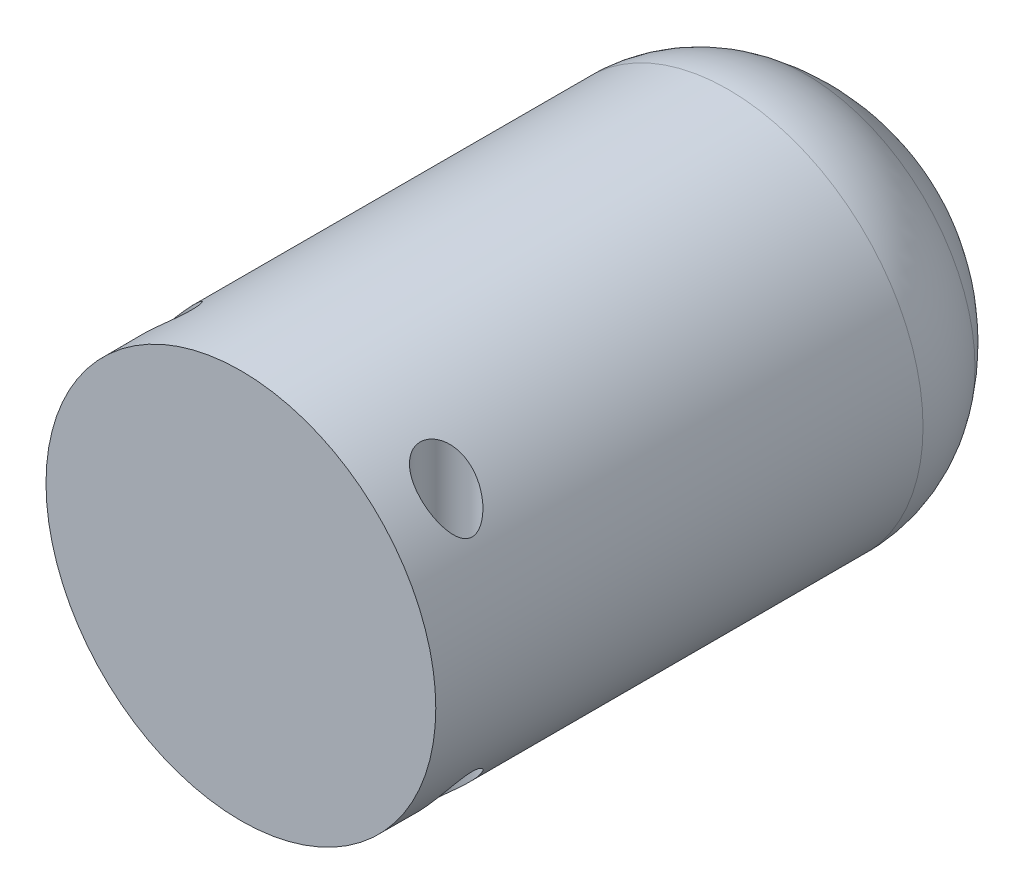
ISO-10303-21;
HEADER;
FILE_DESCRIPTION(('STEP AP214'),'2;1');
FILE_NAME('part.step','',(''),(''),'','','');
FILE_SCHEMA(('AUTOMOTIVE_DESIGN { 1 0 10303 214 1 1 1 1 }'));
ENDSEC;
DATA;
#1=APPLICATION_CONTEXT('core data for automotive mechanical design processes');
#2=APPLICATION_PROTOCOL_DEFINITION('international standard','automotive_design',2000,#1);
#3=PRODUCT_CONTEXT('',#1,'mechanical');
#4=PRODUCT('Part','Part','',(#3));
#5=PRODUCT_RELATED_PRODUCT_CATEGORY('part','',(#4));
#6=PRODUCT_DEFINITION_FORMATION('','',#4);
#7=PRODUCT_DEFINITION_CONTEXT('part definition',#1,'design');
#8=PRODUCT_DEFINITION('design','',#6,#7);
#9=PRODUCT_DEFINITION_SHAPE('','',#8);
#10=(LENGTH_UNIT() NAMED_UNIT(*) SI_UNIT(.MILLI.,.METRE.));
#11=(NAMED_UNIT(*) PLANE_ANGLE_UNIT() SI_UNIT($,.RADIAN.));
#12=(NAMED_UNIT(*) SI_UNIT($,.STERADIAN.) SOLID_ANGLE_UNIT());
#13=UNCERTAINTY_MEASURE_WITH_UNIT(LENGTH_MEASURE(1.E-05),#10,'distance_accuracy_value','');
#14=(GEOMETRIC_REPRESENTATION_CONTEXT(3) GLOBAL_UNCERTAINTY_ASSIGNED_CONTEXT((#13)) GLOBAL_UNIT_ASSIGNED_CONTEXT((#10,
#11,#12)) REPRESENTATION_CONTEXT('',''));
#15=CARTESIAN_POINT('',(0.,0.,0.));
#16=DIRECTION('',(0.,0.,1.));
#17=DIRECTION('',(1.,0.,0.));
#18=AXIS2_PLACEMENT_3D('',#15,#16,#17);
#19=CARTESIAN_POINT('',(0.,0.,4.));
#20=DIRECTION('',(0.,0.,-1.));
#21=DIRECTION('',(-1.,0.,0.));
#22=AXIS2_PLACEMENT_3D('',#19,#20,#21);
#23=CYLINDRICAL_SURFACE('',#22,1.5);
#24=CARTESIAN_POINT('',(1.08,-1.04096109437385,3.7));
#25=CARTESIAN_POINT('',(1.09674566237152,-1.02358636530582,3.70000106403355));
#26=CARTESIAN_POINT('',(1.11307534458666,-1.00579812237913,3.69790706807519));
#27=CARTESIAN_POINT('',(1.14449965980971,-0.969892923717547,3.69000932065761));
#28=CARTESIAN_POINT('',(1.15959069974288,-0.951775185853375,3.68419517903112));
#29=CARTESIAN_POINT('',(1.18584377708941,-0.918773125676367,3.67023562941143));
#30=CARTESIAN_POINT('',(1.19724379068756,-0.90384711755566,3.66263095431329));
#31=CARTESIAN_POINT('',(1.21871201068598,-0.874679686967802,3.64475581130309));
#32=CARTESIAN_POINT('',(1.22878509358711,-0.860435887668466,3.63449554002303));
#33=CARTESIAN_POINT('',(1.24254337312409,-0.840328780648158,3.61676684740489));
#34=CARTESIAN_POINT('',(1.24688991082239,-0.833858952348881,3.61049646244525));
#35=CARTESIAN_POINT('',(1.25504892763468,-0.821526818153933,3.59705553291959));
#36=CARTESIAN_POINT('',(1.25886159090687,-0.815664302950111,3.58988530037937));
#37=CARTESIAN_POINT('',(1.26514120756119,-0.805881620213636,3.57595915939488));
#38=CARTESIAN_POINT('',(1.26772667693391,-0.801802590726131,3.56937027171994));
#39=CARTESIAN_POINT('',(1.27228015954494,-0.794557415891443,3.55550889131904));
#40=CARTESIAN_POINT('',(1.2742494446965,-0.791389391179177,3.54823784758006));
#41=CARTESIAN_POINT('',(1.2770138815696,-0.786918533019711,3.53492754403332));
#42=CARTESIAN_POINT('',(1.27797761744963,-0.785350196455877,3.52901369391326));
#43=CARTESIAN_POINT('',(1.27937144525257,-0.783077606261038,3.51696154547967));
#44=CARTESIAN_POINT('',(1.27980210872951,-0.782372427171693,3.51082349483623));
#45=CARTESIAN_POINT('',(1.28008971101846,-0.781901804325164,3.49847879991046));
#46=CARTESIAN_POINT('',(1.27994497516977,-0.78213910358534,3.49227200791418));
#47=CARTESIAN_POINT('',(1.27909291315129,-0.783531707255199,3.48000140104512));
#48=CARTESIAN_POINT('',(1.27838514217861,-0.784687737470018,3.47393770311935));
#49=CARTESIAN_POINT('',(1.27626239872354,-0.788136494362992,3.46083203355226));
#50=CARTESIAN_POINT('',(1.27472796637781,-0.790620376900913,3.45386054703954));
#51=CARTESIAN_POINT('',(1.27106514191055,-0.796495702613866,3.44048114282348));
#52=CARTESIAN_POINT('',(1.26893559151676,-0.799888915074456,3.43407435650246));
#53=CARTESIAN_POINT('',(1.26292215957587,-0.80936610184605,3.41849834934634));
#54=CARTESIAN_POINT('',(1.25871583494982,-0.815906651315601,3.40973501114434));
#55=CARTESIAN_POINT('',(1.24952062418571,-0.829921368918026,3.39346211770816));
#56=CARTESIAN_POINT('',(1.24452963211681,-0.837398038132566,3.38595605213412));
#57=CARTESIAN_POINT('',(1.23021761719906,-0.858381436566414,3.36711711201955));
#58=CARTESIAN_POINT('',(1.22032470324125,-0.872423045315042,3.35681737072206));
#59=CARTESIAN_POINT('',(1.1992505545213,-0.901176566104844,3.33884616495344));
#60=CARTESIAN_POINT('',(1.18806736372839,-0.915889474857987,3.33117876289473));
#61=CARTESIAN_POINT('',(1.16390375764478,-0.946429806340609,3.31789712468596));
#62=CARTESIAN_POINT('',(1.1508553223737,-0.962270464640591,3.31243667544765));
#63=CARTESIAN_POINT('',(1.12374591970883,-0.993794255584474,3.30433159878075));
#64=CARTESIAN_POINT('',(1.10968555586458,-1.00947747587225,3.30168530750857));
#65=CARTESIAN_POINT('',(1.08179349146516,-1.03928354006377,3.29955401063209));
#66=CARTESIAN_POINT('',(1.06801348439242,-1.05343919416047,3.29986261220226));
#67=CARTESIAN_POINT('',(1.04010005625374,-1.08100623829531,3.30351691862372));
#68=CARTESIAN_POINT('',(1.02596704946911,-1.09441844632517,3.3068592122684));
#69=CARTESIAN_POINT('',(1.00145687679212,-1.1168198421505,3.31573121573981));
#70=CARTESIAN_POINT('',(0.991037494903741,-1.12606720123624,3.32048973296841));
#71=CARTESIAN_POINT('',(0.970650613247731,-1.14368603851268,3.33213094303833));
#72=CARTESIAN_POINT('',(0.960682467161492,-1.15205879346851,3.33901047987029));
#73=CARTESIAN_POINT('',(0.943583048043093,-1.16608240462301,3.35340852024991));
#74=CARTESIAN_POINT('',(0.936283730159327,-1.17194240031072,3.36052227507417));
#75=CARTESIAN_POINT('',(0.922589831139405,-1.18275271438417,3.37618536274545));
#76=CARTESIAN_POINT('',(0.916195080283184,-1.187703203469,3.38473442563168));
#77=CARTESIAN_POINT('',(0.904619017344817,-1.1965442732876,3.4032445112297));
#78=CARTESIAN_POINT('',(0.899448873239332,-1.20042514821463,3.41321729192142));
#79=CARTESIAN_POINT('',(0.890773959050301,-1.20687670509543,3.43425452305049));
#80=CARTESIAN_POINT('',(0.88726740401303,-1.20944879153445,3.44531778797975));
#81=CARTESIAN_POINT('',(0.882591128710115,-1.21286435974034,3.46640649235452));
#82=CARTESIAN_POINT('',(0.881150489727061,-1.21390873219965,3.47633993568876));
#83=CARTESIAN_POINT('',(0.879782007845974,-1.21490100508157,3.49636301802288));
#84=CARTESIAN_POINT('',(0.879853291479567,-1.21484953859249,3.5064525634726));
#85=CARTESIAN_POINT('',(0.881429534326233,-1.213706173469,3.52556841149142));
#86=CARTESIAN_POINT('',(0.882809480603346,-1.21270499592799,3.53461097085489));
#87=CARTESIAN_POINT('',(0.886744376874135,-1.20983068921153,3.55229017868575));
#88=CARTESIAN_POINT('',(0.889299286075588,-1.20795759030732,3.56092684123353));
#89=CARTESIAN_POINT('',(0.895518058015695,-1.20335471839148,3.57777432914172));
#90=CARTESIAN_POINT('',(0.899205042834901,-1.20060703490278,3.58597163691198));
#91=CARTESIAN_POINT('',(0.907488688836431,-1.19435805044396,3.60157750549185));
#92=CARTESIAN_POINT('',(0.912085600799952,-1.19085654169187,3.6089858479904));
#93=CARTESIAN_POINT('',(0.922549536478323,-1.18277239942132,3.62369116529422));
#94=CARTESIAN_POINT('',(0.928500721578262,-1.17811312413768,3.63088576313835));
#95=CARTESIAN_POINT('',(0.94105208811556,-1.16811199126448,3.64414228980987));
#96=CARTESIAN_POINT('',(0.947652766622357,-1.1627696099299,3.65020334065993));
#97=CARTESIAN_POINT('',(0.964548637281384,-1.1488321877008,3.66382413741054));
#98=CARTESIAN_POINT('',(0.975104269868876,-1.13990117260708,3.67071970128871));
#99=CARTESIAN_POINT('',(0.996638587696924,-1.1211229551904,3.68220982441997));
#100=CARTESIAN_POINT('',(1.00761790730883,-1.1112743451281,3.68680077674494));
#101=CARTESIAN_POINT('',(1.02894270466975,-1.09154696300944,3.69367686414857));
#102=CARTESIAN_POINT('',(1.03928544379138,-1.08170763017453,3.69608691042479));
#103=CARTESIAN_POINT('',(1.05980178194275,-1.06161521495443,3.699247927352));
#104=CARTESIAN_POINT('',(1.06997542758735,-1.05136224936123,3.69999936303019));
#105=CARTESIAN_POINT('',(1.08,-1.04096109437385,3.7));
#106=B_SPLINE_CURVE_WITH_KNOTS('',3,(#24,#25,#26,#27,#28,#29,#30,#31,#32,#33,#34,#35,#36,#37,
#38,#39,#40,#41,#42,#43,#44,#45,#46,#47,#48,#49,#50,#51,#52,#53,#54,#55,#56,#57,#58,#59,#60,#61,
#62,#63,#64,#65,#66,#67,#68,#69,#70,#71,#72,#73,#74,#75,#76,#77,#78,#79,#80,#81,#82,#83,#84,#85,
#86,#87,#88,#89,#90,#91,#92,#93,#94,#95,#96,#97,#98,#99,#100,#101,#102,#103,#104,#105),
.UNSPECIFIED.,.T.,.F.,(4,2,2,2,2,2,2,2,2,2,2,2,2,2,2,2,2,2,2,2,2,2,2,2,2,2,2,2,2,2,2,2,2,2,2,2,
2,2,2,2,4),(0.,0.0723401926849724,0.144883314843112,0.205494675345033,0.265876673928711,
0.295835298335102,0.32578356302192,0.350214606297052,0.374594881716146,0.393099938524114,
0.411585137191144,0.430124175104159,0.44867787358858,0.471226527192378,0.49381937637807,
0.528770334157092,0.563816748874724,0.623572604404388,0.683420269169632,0.746918909587598,
0.810379986142155,0.869442653345332,0.928438990248444,0.972450903363948,1.01639764166674,
1.05153206566961,1.08665988878117,1.1220966911855,1.15749538507328,1.18760377909101,
1.2176947793526,1.24517319767839,1.27265066208373,1.3007315741818,1.3288202363449,
1.36000647518084,1.39121676986112,1.43731433665219,1.48348382715657,1.52680148676186,
1.57010699978528),.UNSPECIFIED.);
#107=CARTESIAN_POINT('',(1.08,-1.04096109437385,3.7));
#108=VERTEX_POINT('',#107);
#109=EDGE_CURVE('E45',#108,#108,#106,.T.);
#110=ORIENTED_EDGE('',*,*,#109,.T.);
#111=EDGE_LOOP('',(#110));
#112=FACE_BOUND('',#111,.T.);
#113=CARTESIAN_POINT('',(1.08,1.04096109437385,3.7));
#114=CARTESIAN_POINT('',(1.06828289142977,1.05311804450826,3.69999962220803));
#115=CARTESIAN_POINT('',(1.05635945630564,1.06507563006324,3.69897353045171));
#116=CARTESIAN_POINT('',(1.03232677106869,1.0883843405039,3.69461806758605));
#117=CARTESIAN_POINT('',(1.02021762994653,1.09973580481452,3.69129000045718));
#118=CARTESIAN_POINT('',(0.997943484279401,1.11995588612057,3.68272242233568));
#119=CARTESIAN_POINT('',(0.987753643619417,1.1289445647023,3.67783452846258));
#120=CARTESIAN_POINT('',(0.967847097201718,1.14605559886943,3.6659981979487));
#121=CARTESIAN_POINT('',(0.958129837825034,1.15417898209746,3.65905224344784));
#122=CARTESIAN_POINT('',(0.941407176117743,1.16783826929135,3.64453387880121));
#123=CARTESIAN_POINT('',(0.934238903840336,1.17357172250187,3.63733647388383));
#124=CARTESIAN_POINT('',(0.920824891985628,1.18412594969258,3.62153397918259));
#125=CARTESIAN_POINT('',(0.914578927758689,1.18894694600381,3.61292923326921));
#126=CARTESIAN_POINT('',(0.903313889736359,1.19752863781006,3.59434518115105));
#127=CARTESIAN_POINT('',(0.898305873785989,1.20127981991462,3.5843546491199));
#128=CARTESIAN_POINT('',(0.889954262043787,1.20748037755386,3.563325661995));
#129=CARTESIAN_POINT('',(0.886608959366373,1.20993108828438,3.55228829546946));
#130=CARTESIAN_POINT('',(0.882211572031433,1.21314013028393,3.53126693268934));
#131=CARTESIAN_POINT('',(0.880893938221647,1.21409482916073,3.52136783221808));
#132=CARTESIAN_POINT('',(0.879756886674885,1.21491910115143,3.50144086239022));
#133=CARTESIAN_POINT('',(0.879936644394447,1.21478927146436,3.49141306693714));
#134=CARTESIAN_POINT('',(0.881703550082539,1.21350722259191,3.47239146038497));
#135=CARTESIAN_POINT('',(0.883173500224399,1.21244013588478,3.46338053889797));
#136=CARTESIAN_POINT('',(0.88727766846651,1.20943984866558,3.4457805485829));
#137=CARTESIAN_POINT('',(0.889911859327779,1.20750666841694,3.43719146989047));
#138=CARTESIAN_POINT('',(0.896288743349464,1.20278115900003,3.42042150811997));
#139=CARTESIAN_POINT('',(0.90005808528461,1.19996810453217,3.41225670157548));
#140=CARTESIAN_POINT('',(0.908497251704892,1.19359150264768,3.39672851128239));
#141=CARTESIAN_POINT('',(0.913167359507229,1.1900277190722,3.38936538082734));
#142=CARTESIAN_POINT('',(0.923789559507501,1.18180485349907,3.37474459785536));
#143=CARTESIAN_POINT('',(0.929826939634871,1.17706743654047,3.36759332665783));
#144=CARTESIAN_POINT('',(0.942539522927102,1.16691290259047,3.35443734344462));
#145=CARTESIAN_POINT('',(0.949215137316103,1.16149534666167,3.34843337822762));
#146=CARTESIAN_POINT('',(0.966315994691957,1.14734813735693,3.33493942780463));
#147=CARTESIAN_POINT('',(0.976998408016286,1.13828014441341,3.32812683681085));
#148=CARTESIAN_POINT('',(0.998770072640615,1.11922709081952,3.31682563139153));
#149=CARTESIAN_POINT('',(1.0098601509244,1.10924009634739,3.31234205584283));
#150=CARTESIAN_POINT('',(1.03574900443915,1.08518636976486,3.30434403522954));
#151=CARTESIAN_POINT('',(1.05055994339329,1.07086369087465,3.30164200359964));
#152=CARTESIAN_POINT('',(1.0796782071611,1.04150119849271,3.29946674120463));
#153=CARTESIAN_POINT('',(1.09398504331803,1.0264607207291,3.29999656111789));
#154=CARTESIAN_POINT('',(1.12209415097323,0.995665196510639,3.30395391531978));
#155=CARTESIAN_POINT('',(1.13587758344327,0.979901679192268,3.30744698767843));
#156=CARTESIAN_POINT('',(1.16237326448331,0.948321088002472,3.31720423676757));
#157=CARTESIAN_POINT('',(1.17508521215936,0.932504000375972,3.32346918883015));
#158=CARTESIAN_POINT('',(1.19737299498558,0.903647123455376,3.33761147416532));
#159=CARTESIAN_POINT('',(1.20713077716326,0.8905534991761,3.34509404094412));
#160=CARTESIAN_POINT('',(1.22554244379274,0.865037857400498,3.36224692063145));
#161=CARTESIAN_POINT('',(1.23419880476931,0.852614370721872,3.37191218484503));
#162=CARTESIAN_POINT('',(1.24651759101567,0.834419766527512,3.38896890107688));
#163=CARTESIAN_POINT('',(1.250688347849,0.828148170800904,3.395458716771));
#164=CARTESIAN_POINT('',(1.25845806608845,0.81629224308374,3.40935731413989));
#165=CARTESIAN_POINT('',(1.26205758683254,0.810707240024415,3.41676518406206));
#166=CARTESIAN_POINT('',(1.26773664068993,0.801788653191029,3.43073477734705));
#167=CARTESIAN_POINT('',(1.2699747445291,0.79823407398739,3.43708869840093));
#168=CARTESIAN_POINT('',(1.27387022016668,0.792002636537817,3.45038111049607));
#169=CARTESIAN_POINT('',(1.27552865455472,0.78932417287304,3.45731850269632));
#170=CARTESIAN_POINT('',(1.27786183684887,0.785540012484555,3.47025224984888));
#171=CARTESIAN_POINT('',(1.27866614345113,0.784228218231973,3.47616402255544));
#172=CARTESIAN_POINT('',(1.27973992589642,0.782474812186053,3.48816240043187));
#173=CARTESIAN_POINT('',(1.28000987119282,0.782032436583266,3.49424884737071));
#174=CARTESIAN_POINT('',(1.27998955935685,0.782065679130898,3.50642614943533));
#175=CARTESIAN_POINT('',(1.27969857617275,0.782542487049401,3.51251700005981));
#176=CARTESIAN_POINT('',(1.27858329455237,0.784363340041815,3.52451746564167));
#177=CARTESIAN_POINT('',(1.27775852767416,0.785708146857929,3.53042691662914));
#178=CARTESIAN_POINT('',(1.27534200461333,0.78962608798233,3.54356439639837));
#179=CARTESIAN_POINT('',(1.27359922380459,0.792439168054664,3.55069215611591));
#180=CARTESIAN_POINT('',(1.26950760021309,0.798977710652699,3.56432594012524));
#181=CARTESIAN_POINT('',(1.26715745176832,0.802705137867757,3.57083058308949));
#182=CARTESIAN_POINT('',(1.2604916206402,0.813152956743788,3.58680653584269));
#183=CARTESIAN_POINT('',(1.25582618136327,0.82035595040238,3.59581237862135));
#184=CARTESIAN_POINT('',(1.24567528141593,0.835690679617499,3.61245848529472));
#185=CARTESIAN_POINT('',(1.24018764943263,0.843824860489176,3.62009501201157));
#186=CARTESIAN_POINT('',(1.22457620182884,0.86643441576678,3.63905616897291));
#187=CARTESIAN_POINT('',(1.21386464848499,0.881414912929869,3.64929318321897));
#188=CARTESIAN_POINT('',(1.19107989217342,0.911973435140522,3.66693801324518));
#189=CARTESIAN_POINT('',(1.17900453377009,0.92755237962887,3.67434126700667));
#190=CARTESIAN_POINT('',(1.15306042395753,0.959634426801103,3.6867600364323));
#191=CARTESIAN_POINT('',(1.13913149086304,0.976143989269669,3.69163380911218));
#192=CARTESIAN_POINT('',(1.11025129373739,1.00886913196019,3.69825171156888));
#193=CARTESIAN_POINT('',(1.09530158379093,1.02508511353704,3.70000049336536));
#194=CARTESIAN_POINT('',(1.08,1.04096109437385,3.7));
#195=B_SPLINE_CURVE_WITH_KNOTS('',3,(#113,#114,#115,#116,#117,#118,#119,#120,#121,#122,#123,
#124,#125,#126,#127,#128,#129,#130,#131,#132,#133,#134,#135,#136,#137,#138,#139,#140,#141,#142,
#143,#144,#145,#146,#147,#148,#149,#150,#151,#152,#153,#154,#155,#156,#157,#158,#159,#160,#161,
#162,#163,#164,#165,#166,#167,#168,#169,#170,#171,#172,#173,#174,#175,#176,#177,#178,#179,#180,
#181,#182,#183,#184,#185,#186,#187,#188,#189,#190,#191,#192,#193,#194),.UNSPECIFIED.,.T.,.F.,(4,
2,2,2,2,2,2,2,2,2,2,2,2,2,2,2,2,2,2,2,2,2,2,2,2,2,2,2,2,2,2,2,2,2,2,2,2,2,2,2,4),(0.,
0.0506120199724183,0.101195393637311,0.144365450652915,0.187483652560368,0.222340584702529,
0.257189012571354,0.292338302489304,0.327451434414194,0.357383208963317,0.387298502574506,
0.414748601990248,0.442198059207904,0.470350150898313,0.498511111726742,0.529861295859376,
0.561231817301134,0.607714107402122,0.654296548459419,0.71630258305267,0.778367156758344,
0.841841308249356,0.905333225550673,0.95908542667691,1.01271454694718,1.04248278706955,
1.07222169670476,1.09499971288317,1.11773575305629,1.1359835053974,1.15421521938105,
1.17247054788344,1.19074191879819,1.2141853910057,1.23767968517915,1.27479025671658,
1.31200061904054,1.37486796287969,1.43783609423801,1.50402986734883,1.57012501870756),.UNSPECIFIED.);
#196=CARTESIAN_POINT('',(1.08,1.04096109437385,3.7));
#197=VERTEX_POINT('',#196);
#198=EDGE_CURVE('E101',#197,#197,#195,.T.);
#199=ORIENTED_EDGE('',*,*,#198,.T.);
#200=EDGE_LOOP('',(#199));
#201=FACE_BOUND('',#200,.T.);
#202=CARTESIAN_POINT('',(-1.08,-1.04096109437385,3.7));
#203=CARTESIAN_POINT('',(-1.06828289142977,-1.05311804450826,3.69999962220803));
#204=CARTESIAN_POINT('',(-1.05635945630564,-1.06507563006324,3.69897353045171));
#205=CARTESIAN_POINT('',(-1.03232677106869,-1.0883843405039,3.69461806758605));
#206=CARTESIAN_POINT('',(-1.02021762994653,-1.09973580481452,3.69129000045718));
#207=CARTESIAN_POINT('',(-0.997943484279401,-1.11995588612057,3.68272242233568));
#208=CARTESIAN_POINT('',(-0.987753643619416,-1.1289445647023,3.67783452846258));
#209=CARTESIAN_POINT('',(-0.967847097201718,-1.14605559886943,3.6659981979487));
#210=CARTESIAN_POINT('',(-0.958129837825034,-1.15417898209745,3.65905224344784));
#211=CARTESIAN_POINT('',(-0.941407176117743,-1.16783826929135,3.64453387880121));
#212=CARTESIAN_POINT('',(-0.934238903840336,-1.17357172250187,3.63733647388383));
#213=CARTESIAN_POINT('',(-0.920824891985628,-1.18412594969258,3.62153397918259));
#214=CARTESIAN_POINT('',(-0.914578927758689,-1.18894694600381,3.61292923326921));
#215=CARTESIAN_POINT('',(-0.903313889736359,-1.19752863781006,3.59434518115105));
#216=CARTESIAN_POINT('',(-0.898305873785989,-1.20127981991462,3.5843546491199));
#217=CARTESIAN_POINT('',(-0.889954262043787,-1.20748037755386,3.563325661995));
#218=CARTESIAN_POINT('',(-0.886608959366373,-1.20993108828438,3.55228829546946));
#219=CARTESIAN_POINT('',(-0.882211572031433,-1.21314013028393,3.53126693268934));
#220=CARTESIAN_POINT('',(-0.880893938221647,-1.21409482916073,3.52136783221808));
#221=CARTESIAN_POINT('',(-0.879756886674885,-1.21491910115143,3.50144086239022));
#222=CARTESIAN_POINT('',(-0.879936644394447,-1.21478927146436,3.49141306693714));
#223=CARTESIAN_POINT('',(-0.881703550082539,-1.21350722259191,3.47239146038497));
#224=CARTESIAN_POINT('',(-0.883173500224399,-1.21244013588478,3.46338053889797));
#225=CARTESIAN_POINT('',(-0.88727766846651,-1.20943984866558,3.4457805485829));
#226=CARTESIAN_POINT('',(-0.889911859327779,-1.20750666841694,3.43719146989047));
#227=CARTESIAN_POINT('',(-0.896288743349464,-1.20278115900003,3.42042150811997));
#228=CARTESIAN_POINT('',(-0.90005808528461,-1.19996810453217,3.41225670157548));
#229=CARTESIAN_POINT('',(-0.908497251704892,-1.19359150264768,3.39672851128239));
#230=CARTESIAN_POINT('',(-0.913167359507229,-1.1900277190722,3.38936538082734));
#231=CARTESIAN_POINT('',(-0.923789559507501,-1.18180485349907,3.37474459785536));
#232=CARTESIAN_POINT('',(-0.929826939634871,-1.17706743654047,3.36759332665783));
#233=CARTESIAN_POINT('',(-0.942539522927102,-1.16691290259047,3.35443734344462));
#234=CARTESIAN_POINT('',(-0.949215137316103,-1.16149534666167,3.34843337822762));
#235=CARTESIAN_POINT('',(-0.966315994691957,-1.14734813735693,3.33493942780463));
#236=CARTESIAN_POINT('',(-0.976998408016286,-1.13828014441341,3.32812683681085));
#237=CARTESIAN_POINT('',(-0.998770072640615,-1.11922709081952,3.31682563139153));
#238=CARTESIAN_POINT('',(-1.0098601509244,-1.10924009634739,3.31234205584283));
#239=CARTESIAN_POINT('',(-1.03574900443915,-1.08518636976486,3.30434403522954));
#240=CARTESIAN_POINT('',(-1.05055994339329,-1.07086369087465,3.30164200359964));
#241=CARTESIAN_POINT('',(-1.0796782071611,-1.04150119849271,3.29946674120463));
#242=CARTESIAN_POINT('',(-1.09398504331803,-1.0264607207291,3.29999656111789));
#243=CARTESIAN_POINT('',(-1.12209415097323,-0.99566519651064,3.30395391531978));
#244=CARTESIAN_POINT('',(-1.13587758344327,-0.979901679192269,3.30744698767843));
#245=CARTESIAN_POINT('',(-1.16237326448331,-0.948321088002473,3.31720423676757));
#246=CARTESIAN_POINT('',(-1.17508521215936,-0.932504000375972,3.32346918883015));
#247=CARTESIAN_POINT('',(-1.19737299498558,-0.903647123455377,3.33761147416532));
#248=CARTESIAN_POINT('',(-1.20713077716326,-0.890553499176101,3.34509404094412));
#249=CARTESIAN_POINT('',(-1.22554244379274,-0.865037857400498,3.36224692063145));
#250=CARTESIAN_POINT('',(-1.23419880476931,-0.852614370721872,3.37191218484503));
#251=CARTESIAN_POINT('',(-1.24651759101567,-0.834419766527512,3.38896890107688));
#252=CARTESIAN_POINT('',(-1.250688347849,-0.828148170800904,3.395458716771));
#253=CARTESIAN_POINT('',(-1.25845806608845,-0.81629224308374,3.40935731413989));
#254=CARTESIAN_POINT('',(-1.26205758683254,-0.810707240024415,3.41676518406206));
#255=CARTESIAN_POINT('',(-1.26773664068993,-0.801788653191029,3.43073477734705));
#256=CARTESIAN_POINT('',(-1.2699747445291,-0.79823407398739,3.43708869840093));
#257=CARTESIAN_POINT('',(-1.27387022016668,-0.792002636537817,3.45038111049607));
#258=CARTESIAN_POINT('',(-1.27552865455472,-0.78932417287304,3.45731850269632));
#259=CARTESIAN_POINT('',(-1.27786183684887,-0.785540012484555,3.47025224984888));
#260=CARTESIAN_POINT('',(-1.27866614345113,-0.784228218231973,3.47616402255544));
#261=CARTESIAN_POINT('',(-1.27973992589642,-0.782474812186053,3.48816240043187));
#262=CARTESIAN_POINT('',(-1.28000987119282,-0.782032436583266,3.49424884737071));
#263=CARTESIAN_POINT('',(-1.27998955935685,-0.782065679130898,3.50642614943533));
#264=CARTESIAN_POINT('',(-1.27969857617275,-0.782542487049401,3.51251700005981));
#265=CARTESIAN_POINT('',(-1.27858329455237,-0.784363340041815,3.52451746564167));
#266=CARTESIAN_POINT('',(-1.27775852767416,-0.785708146857929,3.53042691662914));
#267=CARTESIAN_POINT('',(-1.27534200461333,-0.78962608798233,3.54356439639837));
#268=CARTESIAN_POINT('',(-1.27359922380459,-0.792439168054664,3.55069215611591));
#269=CARTESIAN_POINT('',(-1.26950760021309,-0.798977710652699,3.56432594012524));
#270=CARTESIAN_POINT('',(-1.26715745176832,-0.802705137867757,3.57083058308949));
#271=CARTESIAN_POINT('',(-1.2604916206402,-0.813152956743789,3.5868065358427));
#272=CARTESIAN_POINT('',(-1.25582618136327,-0.820355950402381,3.59581237862135));
#273=CARTESIAN_POINT('',(-1.24567528141593,-0.8356906796175,3.61245848529472));
#274=CARTESIAN_POINT('',(-1.24018764943263,-0.843824860489177,3.62009501201157));
#275=CARTESIAN_POINT('',(-1.22457620182884,-0.866434415766782,3.63905616897291));
#276=CARTESIAN_POINT('',(-1.21386464848499,-0.881414912929871,3.64929318321897));
#277=CARTESIAN_POINT('',(-1.19107989217342,-0.911973435140524,3.66693801324518));
#278=CARTESIAN_POINT('',(-1.17900453377008,-0.927552379628874,3.67434126700667));
#279=CARTESIAN_POINT('',(-1.15306042395753,-0.959634426801106,3.68676003643231));
#280=CARTESIAN_POINT('',(-1.13913149086304,-0.976143989269671,3.69163380911218));
#281=CARTESIAN_POINT('',(-1.11025129373739,-1.00886913196019,3.69825171156888));
#282=CARTESIAN_POINT('',(-1.09530158379093,-1.02508511353704,3.70000049336536));
#283=CARTESIAN_POINT('',(-1.08,-1.04096109437385,3.7));
#284=B_SPLINE_CURVE_WITH_KNOTS('',3,(#202,#203,#204,#205,#206,#207,#208,#209,#210,#211,#212,
#213,#214,#215,#216,#217,#218,#219,#220,#221,#222,#223,#224,#225,#226,#227,#228,#229,#230,#231,
#232,#233,#234,#235,#236,#237,#238,#239,#240,#241,#242,#243,#244,#245,#246,#247,#248,#249,#250,
#251,#252,#253,#254,#255,#256,#257,#258,#259,#260,#261,#262,#263,#264,#265,#266,#267,#268,#269,
#270,#271,#272,#273,#274,#275,#276,#277,#278,#279,#280,#281,#282,#283),.UNSPECIFIED.,.T.,.F.,(4,
2,2,2,2,2,2,2,2,2,2,2,2,2,2,2,2,2,2,2,2,2,2,2,2,2,2,2,2,2,2,2,2,2,2,2,2,2,2,2,4),(0.,
0.0506120199724183,0.101195393637311,0.144365450652916,0.187483652560368,0.222340584702529,
0.257189012571354,0.292338302489304,0.327451434414194,0.357383208963317,0.387298502574506,
0.414748601990248,0.442198059207904,0.470350150898313,0.498511111726742,0.529861295859375,
0.561231817301133,0.607714107402121,0.654296548459419,0.71630258305267,0.778367156758342,
0.841841308249355,0.905333225550672,0.959085426676909,1.01271454694718,1.04248278706956,
1.07222169670476,1.09499971288317,1.11773575305629,1.1359835053974,1.15421521938106,
1.17247054788344,1.19074191879819,1.2141853910057,1.23767968517915,1.27479025671658,
1.31200061904054,1.37486796287969,1.43783609423801,1.50402986734883,1.57012501870756),.UNSPECIFIED.);
#285=CARTESIAN_POINT('',(-1.08,-1.04096109437385,3.7));
#286=VERTEX_POINT('',#285);
#287=EDGE_CURVE('E73',#286,#286,#284,.T.);
#288=ORIENTED_EDGE('',*,*,#287,.T.);
#289=EDGE_LOOP('',(#288));
#290=FACE_BOUND('',#289,.T.);
#291=CARTESIAN_POINT('',(-1.08,1.04096109437385,3.7));
#292=CARTESIAN_POINT('',(-1.09674566237152,1.02358636530582,3.70000106403355));
#293=CARTESIAN_POINT('',(-1.11307534458666,1.00579812237913,3.69790706807519));
#294=CARTESIAN_POINT('',(-1.14449965980971,0.969892923717547,3.69000932065761));
#295=CARTESIAN_POINT('',(-1.15959069974288,0.951775185853375,3.68419517903112));
#296=CARTESIAN_POINT('',(-1.18584377708941,0.918773125676367,3.67023562941143));
#297=CARTESIAN_POINT('',(-1.19724379068756,0.90384711755566,3.66263095431329));
#298=CARTESIAN_POINT('',(-1.21871201068598,0.874679686967801,3.64475581130309));
#299=CARTESIAN_POINT('',(-1.22878509358711,0.860435887668466,3.63449554002303));
#300=CARTESIAN_POINT('',(-1.24254337312409,0.840328780648157,3.61676684740489));
#301=CARTESIAN_POINT('',(-1.24688991082239,0.833858952348881,3.61049646244525));
#302=CARTESIAN_POINT('',(-1.25504892763468,0.821526818153933,3.59705553291959));
#303=CARTESIAN_POINT('',(-1.25886159090687,0.815664302950111,3.58988530037937));
#304=CARTESIAN_POINT('',(-1.26514120756119,0.805881620213636,3.57595915939488));
#305=CARTESIAN_POINT('',(-1.26772667693391,0.80180259072613,3.56937027171994));
#306=CARTESIAN_POINT('',(-1.27228015954494,0.794557415891443,3.55550889131904));
#307=CARTESIAN_POINT('',(-1.2742494446965,0.791389391179177,3.54823784758006));
#308=CARTESIAN_POINT('',(-1.2770138815696,0.786918533019712,3.53492754403332));
#309=CARTESIAN_POINT('',(-1.27797761744963,0.785350196455878,3.52901369391326));
#310=CARTESIAN_POINT('',(-1.27937144525257,0.783077606261038,3.51696154547967));
#311=CARTESIAN_POINT('',(-1.27980210872951,0.782372427171693,3.51082349483623));
#312=CARTESIAN_POINT('',(-1.28008971101846,0.781901804325164,3.49847879991046));
#313=CARTESIAN_POINT('',(-1.27994497516977,0.78213910358534,3.49227200791418));
#314=CARTESIAN_POINT('',(-1.27909291315129,0.783531707255199,3.48000140104512));
#315=CARTESIAN_POINT('',(-1.27838514217861,0.784687737470018,3.47393770311935));
#316=CARTESIAN_POINT('',(-1.27626239872354,0.788136494362992,3.46083203355226));
#317=CARTESIAN_POINT('',(-1.27472796637782,0.790620376900913,3.45386054703954));
#318=CARTESIAN_POINT('',(-1.27106514191055,0.796495702613866,3.44048114282348));
#319=CARTESIAN_POINT('',(-1.26893559151676,0.799888915074456,3.43407435650246));
#320=CARTESIAN_POINT('',(-1.26292215957587,0.80936610184605,3.41849834934634));
#321=CARTESIAN_POINT('',(-1.25871583494982,0.8159066513156,3.40973501114434));
#322=CARTESIAN_POINT('',(-1.24952062418571,0.829921368918024,3.39346211770816));
#323=CARTESIAN_POINT('',(-1.24452963211681,0.837398038132564,3.38595605213412));
#324=CARTESIAN_POINT('',(-1.23021761719906,0.858381436566412,3.36711711201956));
#325=CARTESIAN_POINT('',(-1.22032470324125,0.87242304531504,3.35681737072206));
#326=CARTESIAN_POINT('',(-1.1992505545213,0.901176566104841,3.33884616495344));
#327=CARTESIAN_POINT('',(-1.1880673637284,0.915889474857984,3.33117876289473));
#328=CARTESIAN_POINT('',(-1.16390375764479,0.946429806340606,3.31789712468596));
#329=CARTESIAN_POINT('',(-1.15085532237371,0.962270464640588,3.31243667544765));
#330=CARTESIAN_POINT('',(-1.12374591970883,0.993794255584471,3.30433159878075));
#331=CARTESIAN_POINT('',(-1.10968555586458,1.00947747587225,3.30168530750857));
#332=CARTESIAN_POINT('',(-1.08179349146517,1.03928354006377,3.29955401063209));
#333=CARTESIAN_POINT('',(-1.06801348439243,1.05343919416047,3.29986261220226));
#334=CARTESIAN_POINT('',(-1.04010005625374,1.08100623829531,3.30351691862371));
#335=CARTESIAN_POINT('',(-1.02596704946911,1.09441844632517,3.3068592122684));
#336=CARTESIAN_POINT('',(-1.00145687679213,1.1168198421505,3.31573121573981));
#337=CARTESIAN_POINT('',(-0.991037494903743,1.12606720123624,3.32048973296841));
#338=CARTESIAN_POINT('',(-0.970650613247733,1.14368603851268,3.33213094303833));
#339=CARTESIAN_POINT('',(-0.960682467161494,1.15205879346851,3.33901047987029));
#340=CARTESIAN_POINT('',(-0.943583048043094,1.16608240462301,3.35340852024991));
#341=CARTESIAN_POINT('',(-0.936283730159328,1.17194240031072,3.36052227507417));
#342=CARTESIAN_POINT('',(-0.922589831139406,1.18275271438417,3.37618536274545));
#343=CARTESIAN_POINT('',(-0.916195080283185,1.187703203469,3.38473442563168));
#344=CARTESIAN_POINT('',(-0.904619017344818,1.1965442732876,3.4032445112297));
#345=CARTESIAN_POINT('',(-0.899448873239333,1.20042514821463,3.41321729192142));
#346=CARTESIAN_POINT('',(-0.890773959050301,1.20687670509543,3.43425452305049));
#347=CARTESIAN_POINT('',(-0.887267404013031,1.20944879153445,3.44531778797975));
#348=CARTESIAN_POINT('',(-0.882591128710116,1.21286435974034,3.46640649235452));
#349=CARTESIAN_POINT('',(-0.881150489727061,1.21390873219965,3.47633993568876));
#350=CARTESIAN_POINT('',(-0.879782007845974,1.21490100508157,3.49636301802288));
#351=CARTESIAN_POINT('',(-0.879853291479567,1.21484953859249,3.5064525634726));
#352=CARTESIAN_POINT('',(-0.881429534326233,1.213706173469,3.52556841149141));
#353=CARTESIAN_POINT('',(-0.882809480603346,1.21270499592799,3.53461097085489));
#354=CARTESIAN_POINT('',(-0.886744376874134,1.20983068921153,3.55229017868575));
#355=CARTESIAN_POINT('',(-0.889299286075587,1.20795759030732,3.56092684123353));
#356=CARTESIAN_POINT('',(-0.895518058015695,1.20335471839148,3.57777432914172));
#357=CARTESIAN_POINT('',(-0.8992050428349,1.20060703490278,3.58597163691198));
#358=CARTESIAN_POINT('',(-0.907488688836431,1.19435805044396,3.60157750549185));
#359=CARTESIAN_POINT('',(-0.912085600799951,1.19085654169187,3.6089858479904));
#360=CARTESIAN_POINT('',(-0.922549536478322,1.18277239942132,3.62369116529422));
#361=CARTESIAN_POINT('',(-0.928500721578261,1.17811312413768,3.63088576313835));
#362=CARTESIAN_POINT('',(-0.941052088115559,1.16811199126448,3.64414228980987));
#363=CARTESIAN_POINT('',(-0.947652766622356,1.1627696099299,3.65020334065993));
#364=CARTESIAN_POINT('',(-0.964548637281383,1.1488321877008,3.66382413741054));
#365=CARTESIAN_POINT('',(-0.975104269868874,1.13990117260708,3.67071970128871));
#366=CARTESIAN_POINT('',(-0.996638587696922,1.1211229551904,3.68220982441997));
#367=CARTESIAN_POINT('',(-1.00761790730883,1.1112743451281,3.68680077674494));
#368=CARTESIAN_POINT('',(-1.02894270466975,1.09154696300944,3.69367686414857));
#369=CARTESIAN_POINT('',(-1.03928544379138,1.08170763017453,3.69608691042479));
#370=CARTESIAN_POINT('',(-1.05980178194275,1.06161521495443,3.699247927352));
#371=CARTESIAN_POINT('',(-1.06997542758735,1.05136224936123,3.69999936303019));
#372=CARTESIAN_POINT('',(-1.08,1.04096109437385,3.7));
#373=B_SPLINE_CURVE_WITH_KNOTS('',3,(#291,#292,#293,#294,#295,#296,#297,#298,#299,#300,#301,
#302,#303,#304,#305,#306,#307,#308,#309,#310,#311,#312,#313,#314,#315,#316,#317,#318,#319,#320,
#321,#322,#323,#324,#325,#326,#327,#328,#329,#330,#331,#332,#333,#334,#335,#336,#337,#338,#339,
#340,#341,#342,#343,#344,#345,#346,#347,#348,#349,#350,#351,#352,#353,#354,#355,#356,#357,#358,
#359,#360,#361,#362,#363,#364,#365,#366,#367,#368,#369,#370,#371,#372),.UNSPECIFIED.,.T.,.F.,(4,
2,2,2,2,2,2,2,2,2,2,2,2,2,2,2,2,2,2,2,2,2,2,2,2,2,2,2,2,2,2,2,2,2,2,2,2,2,2,2,4),(0.,
0.0723401926849726,0.144883314843112,0.205494675345033,0.265876673928712,0.295835298335103,
0.32578356302192,0.350214606297052,0.374594881716146,0.393099938524113,0.411585137191144,
0.430124175104159,0.448677873588579,0.471226527192377,0.493819376378069,0.528770334157089,
0.56381674887472,0.623572604404383,0.683420269169628,0.746918909587593,0.81037998614215,
0.869442653345328,0.928438990248441,0.972450903363945,1.01639764166674,1.05153206566961,
1.08665988878116,1.1220966911855,1.15749538507328,1.18760377909101,1.2176947793526,
1.24517319767839,1.27265066208373,1.3007315741818,1.3288202363449,1.36000647518084,
1.39121676986112,1.43731433665218,1.48348382715657,1.52680148676186,1.57010699978528),.UNSPECIFIED.);
#374=CARTESIAN_POINT('',(-1.08,1.04096109437385,3.7));
#375=VERTEX_POINT('',#374);
#376=EDGE_CURVE('E65',#375,#375,#373,.T.);
#377=ORIENTED_EDGE('',*,*,#376,.T.);
#378=EDGE_LOOP('',(#377));
#379=FACE_BOUND('',#378,.T.);
#380=CARTESIAN_POINT('',(0.,0.,0.25));
#381=DIRECTION('',(0.,0.,1.));
#382=DIRECTION('',(1.,0.,0.));
#383=AXIS2_PLACEMENT_3D('',#380,#381,#382);
#384=CIRCLE('',#383,1.5);
#385=CARTESIAN_POINT('',(1.5,0.,0.25));
#386=VERTEX_POINT('',#385);
#387=EDGE_CURVE('E55',#386,#386,#384,.T.);
#388=ORIENTED_EDGE('',*,*,#387,.T.);
#389=EDGE_LOOP('',(#388));
#390=FACE_BOUND('',#389,.T.);
#391=CARTESIAN_POINT('',(0.,0.,4.));
#392=DIRECTION('',(0.,0.,1.));
#393=DIRECTION('',(1.,0.,0.));
#394=AXIS2_PLACEMENT_3D('',#391,#392,#393);
#395=CIRCLE('',#394,1.5);
#396=CARTESIAN_POINT('',(1.5,0.,4.));
#397=VERTEX_POINT('',#396);
#398=EDGE_CURVE('E61',#397,#397,#395,.T.);
#399=ORIENTED_EDGE('',*,*,#398,.F.);
#400=EDGE_LOOP('',(#399));
#401=FACE_BOUND('',#400,.T.);
#402=ADVANCED_FACE('F41',(#112,#201,#290,#379,#390,#401),#23,.T.);
#403=CARTESIAN_POINT('',(0.,0.,4.));
#404=DIRECTION('',(0.,0.,1.));
#405=DIRECTION('',(1.,0.,0.));
#406=AXIS2_PLACEMENT_3D('',#403,#404,#405);
#407=PLANE('',#406);
#408=ORIENTED_EDGE('',*,*,#398,.T.);
#409=EDGE_LOOP('',(#408));
#410=FACE_BOUND('',#409,.T.);
#411=ADVANCED_FACE('F85',(#410),#407,.T.);
#412=CARTESIAN_POINT('',(0.,0.,0.625000000000001));
#413=DIRECTION('',(0.,0.,1.));
#414=DIRECTION('',(1.,0.,0.));
#415=AXIS2_PLACEMENT_3D('',#412,#413,#414);
#416=SPHERICAL_SURFACE('',#415,1.625);
#417=CARTESIAN_POINT('',(0.,0.,-0.35));
#418=DIRECTION('',(0.,0.,1.));
#419=DIRECTION('',(1.,0.,0.));
#420=AXIS2_PLACEMENT_3D('',#417,#418,#419);
#421=CIRCLE('',#420,1.3);
#422=CARTESIAN_POINT('',(1.3,0.,-0.35));
#423=VERTEX_POINT('',#422);
#424=EDGE_CURVE('E10',#423,#423,#421,.F.);
#425=ORIENTED_EDGE('',*,*,#424,.T.);
#426=EDGE_LOOP('',(#425));
#427=FACE_BOUND('',#426,.T.);
#428=ADVANCED_FACE('F88',(#427),#416,.T.);
#429=CARTESIAN_POINT('',(0.,0.,0.25));
#430=DIRECTION('',(0.,0.,1.));
#431=DIRECTION('',(1.,0.,0.));
#432=AXIS2_PLACEMENT_3D('',#429,#430,#431);
#433=DEGENERATE_TOROIDAL_SURFACE('',#432,0.5,1.,.T.);
#434=ORIENTED_EDGE('',*,*,#424,.F.);
#435=EDGE_LOOP('',(#434));
#436=FACE_BOUND('',#435,.T.);
#437=ORIENTED_EDGE('',*,*,#387,.F.);
#438=EDGE_LOOP('',(#437));
#439=FACE_BOUND('',#438,.T.);
#440=ADVANCED_FACE('F43',(#436,#439),#433,.T.);
#441=CARTESIAN_POINT('',(-1.08,-1.5,3.5));
#442=DIRECTION('',(0.,1.,0.));
#443=DIRECTION('',(0.,0.,1.));
#444=AXIS2_PLACEMENT_3D('',#441,#442,#443);
#445=CYLINDRICAL_SURFACE('',#444,0.2);
#446=ORIENTED_EDGE('',*,*,#376,.F.);
#447=EDGE_LOOP('',(#446));
#448=FACE_BOUND('',#447,.T.);
#449=ORIENTED_EDGE('',*,*,#287,.F.);
#450=EDGE_LOOP('',(#449));
#451=FACE_BOUND('',#450,.T.);
#452=ADVANCED_FACE('F79',(#448,#451),#445,.F.);
#453=CARTESIAN_POINT('',(1.08,-1.5,3.5));
#454=DIRECTION('',(0.,1.,0.));
#455=DIRECTION('',(0.,0.,1.));
#456=AXIS2_PLACEMENT_3D('',#453,#454,#455);
#457=CYLINDRICAL_SURFACE('',#456,0.2);
#458=ORIENTED_EDGE('',*,*,#198,.F.);
#459=EDGE_LOOP('',(#458));
#460=FACE_BOUND('',#459,.T.);
#461=ORIENTED_EDGE('',*,*,#109,.F.);
#462=EDGE_LOOP('',(#461));
#463=FACE_BOUND('',#462,.T.);
#464=ADVANCED_FACE('F82',(#460,#463),#457,.F.);
#465=CLOSED_SHELL('',(#402,#411,#428,#440,#452,#464));
#466=MANIFOLD_SOLID_BREP('B2',#465);
#467=ADVANCED_BREP_SHAPE_REPRESENTATION('',(#18,#466),#14);
#468=SHAPE_DEFINITION_REPRESENTATION(#9,#467);
ENDSEC;
END-ISO-10303-21;
